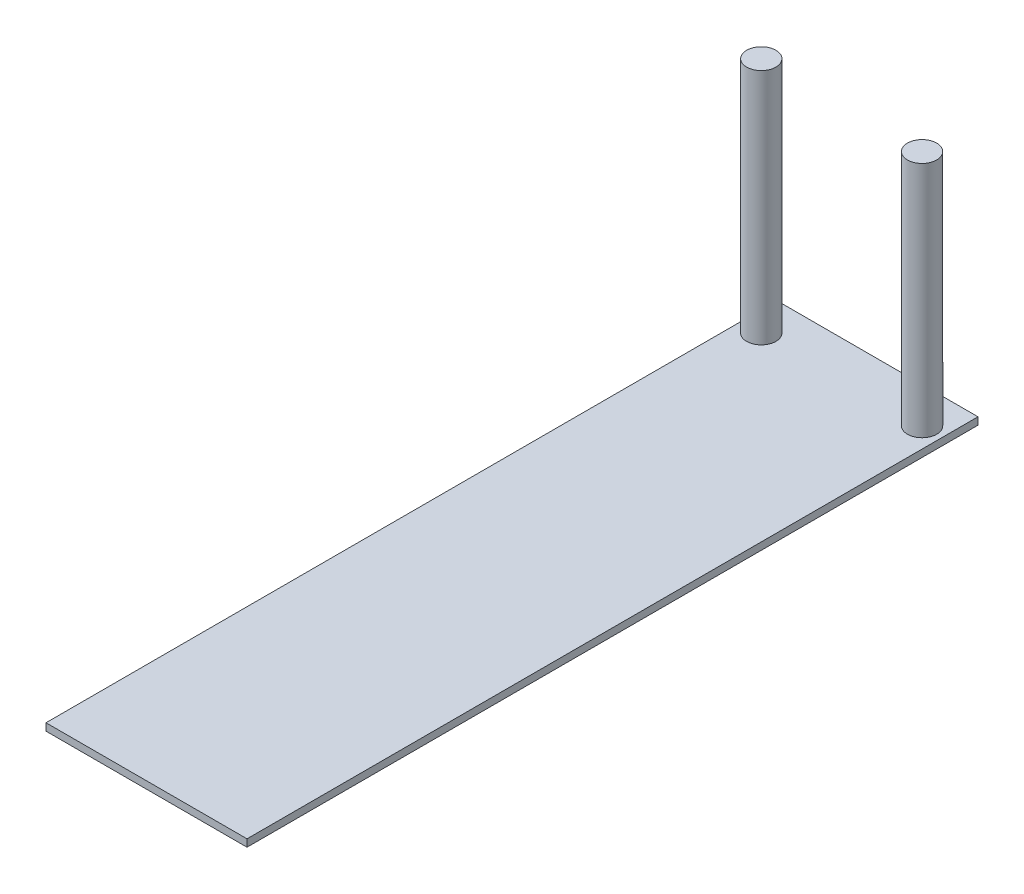
ISO-10303-21;
HEADER;
FILE_DESCRIPTION(('STEP AP214'),'2;1');
FILE_NAME('part.step','',(''),(''),'','','');
FILE_SCHEMA(('AUTOMOTIVE_DESIGN { 1 0 10303 214 1 1 1 1 }'));
ENDSEC;
DATA;
#1=APPLICATION_CONTEXT('core data for automotive mechanical design processes');
#2=APPLICATION_PROTOCOL_DEFINITION('international standard','automotive_design',2000,#1);
#3=PRODUCT_CONTEXT('',#1,'mechanical');
#4=PRODUCT('Part','Part','',(#3));
#5=PRODUCT_RELATED_PRODUCT_CATEGORY('part','',(#4));
#6=PRODUCT_DEFINITION_FORMATION('','',#4);
#7=PRODUCT_DEFINITION_CONTEXT('part definition',#1,'design');
#8=PRODUCT_DEFINITION('design','',#6,#7);
#9=PRODUCT_DEFINITION_SHAPE('','',#8);
#10=(LENGTH_UNIT() NAMED_UNIT(*) SI_UNIT(.MILLI.,.METRE.));
#11=(NAMED_UNIT(*) PLANE_ANGLE_UNIT() SI_UNIT($,.RADIAN.));
#12=(NAMED_UNIT(*) SI_UNIT($,.STERADIAN.) SOLID_ANGLE_UNIT());
#13=UNCERTAINTY_MEASURE_WITH_UNIT(LENGTH_MEASURE(1.E-05),#10,'distance_accuracy_value','');
#14=(GEOMETRIC_REPRESENTATION_CONTEXT(3) GLOBAL_UNCERTAINTY_ASSIGNED_CONTEXT((#13)) GLOBAL_UNIT_ASSIGNED_CONTEXT((#10,
#11,#12)) REPRESENTATION_CONTEXT('',''));
#15=CARTESIAN_POINT('',(0.,0.,0.));
#16=DIRECTION('',(0.,0.,1.));
#17=DIRECTION('',(1.,0.,0.));
#18=AXIS2_PLACEMENT_3D('',#15,#16,#17);
#19=CARTESIAN_POINT('',(62.865,2.54,127.));
#20=DIRECTION('',(-1.,0.,0.));
#21=DIRECTION('',(0.,0.,1.));
#22=AXIS2_PLACEMENT_3D('',#19,#20,#21);
#23=PLANE('',#22);
#24=DIRECTION('',(0.,0.,-1.));
#25=VECTOR('',#24,1.);
#26=CARTESIAN_POINT('',(62.865,0.,127.));
#27=LINE('',#26,#25);
#28=CARTESIAN_POINT('',(62.865,0.,127.));
#29=VERTEX_POINT('',#28);
#30=CARTESIAN_POINT('',(62.865,0.,-127.));
#31=VERTEX_POINT('',#30);
#32=EDGE_CURVE('E100',#29,#31,#27,.T.);
#33=ORIENTED_EDGE('',*,*,#32,.T.);
#34=DIRECTION('',(0.,-1.,0.));
#35=VECTOR('',#34,1.);
#36=CARTESIAN_POINT('',(62.865,2.54,-127.));
#37=LINE('',#36,#35);
#38=CARTESIAN_POINT('',(62.865,2.54,-127.));
#39=VERTEX_POINT('',#38);
#40=EDGE_CURVE('E91',#39,#31,#37,.T.);
#41=ORIENTED_EDGE('',*,*,#40,.F.);
#42=DIRECTION('',(0.,0.,-1.));
#43=VECTOR('',#42,1.);
#44=CARTESIAN_POINT('',(62.865,2.54,127.));
#45=LINE('',#44,#43);
#46=CARTESIAN_POINT('',(62.865,2.54,127.));
#47=VERTEX_POINT('',#46);
#48=EDGE_CURVE('E85',#47,#39,#45,.T.);
#49=ORIENTED_EDGE('',*,*,#48,.F.);
#50=DIRECTION('',(0.,-1.,0.));
#51=VECTOR('',#50,1.);
#52=CARTESIAN_POINT('',(62.865,2.54,127.));
#53=LINE('',#52,#51);
#54=EDGE_CURVE('E96',#47,#29,#53,.T.);
#55=ORIENTED_EDGE('',*,*,#54,.T.);
#56=EDGE_LOOP('',(#33,#41,#49,#55));
#57=FACE_BOUND('',#56,.T.);
#58=ADVANCED_FACE('F33',(#57),#23,.F.);
#59=CARTESIAN_POINT('',(-6.98499999999998,2.54,-127.));
#60=DIRECTION('',(0.,0.,1.));
#61=DIRECTION('',(1.,0.,0.));
#62=AXIS2_PLACEMENT_3D('',#59,#60,#61);
#63=PLANE('',#62);
#64=DIRECTION('',(-1.,0.,0.));
#65=VECTOR('',#64,1.);
#66=CARTESIAN_POINT('',(-6.98499999999998,0.,-127.));
#67=LINE('',#66,#65);
#68=CARTESIAN_POINT('',(-6.98499999999998,0.,-127.));
#69=VERTEX_POINT('',#68);
#70=EDGE_CURVE('E90',#31,#69,#67,.T.);
#71=ORIENTED_EDGE('',*,*,#70,.T.);
#72=DIRECTION('',(0.,-1.,0.));
#73=VECTOR('',#72,1.);
#74=CARTESIAN_POINT('',(-6.98499999999998,2.54,-127.));
#75=LINE('',#74,#73);
#76=CARTESIAN_POINT('',(-6.98499999999998,2.54,-127.));
#77=VERTEX_POINT('',#76);
#78=EDGE_CURVE('E88',#77,#69,#75,.T.);
#79=ORIENTED_EDGE('',*,*,#78,.F.);
#80=DIRECTION('',(-1.,0.,0.));
#81=VECTOR('',#80,1.);
#82=CARTESIAN_POINT('',(-6.98499999999998,2.54,-127.));
#83=LINE('',#82,#81);
#84=EDGE_CURVE('E80',#39,#77,#83,.T.);
#85=ORIENTED_EDGE('',*,*,#84,.F.);
#86=ORIENTED_EDGE('',*,*,#40,.T.);
#87=EDGE_LOOP('',(#71,#79,#85,#86));
#88=FACE_BOUND('',#87,.T.);
#89=ADVANCED_FACE('F89',(#88),#63,.F.);
#90=CARTESIAN_POINT('',(-6.98499999999998,2.54,127.));
#91=DIRECTION('',(1.,0.,0.));
#92=DIRECTION('',(0.,0.,-1.));
#93=AXIS2_PLACEMENT_3D('',#90,#91,#92);
#94=PLANE('',#93);
#95=DIRECTION('',(0.,0.,1.));
#96=VECTOR('',#95,1.);
#97=CARTESIAN_POINT('',(-6.98499999999998,0.,127.));
#98=LINE('',#97,#96);
#99=CARTESIAN_POINT('',(-6.98499999999998,0.,127.));
#100=VERTEX_POINT('',#99);
#101=EDGE_CURVE('E66',#69,#100,#98,.T.);
#102=ORIENTED_EDGE('',*,*,#101,.T.);
#103=DIRECTION('',(0.,-1.,0.));
#104=VECTOR('',#103,1.);
#105=CARTESIAN_POINT('',(-6.98499999999998,2.54,127.));
#106=LINE('',#105,#104);
#107=CARTESIAN_POINT('',(-6.98499999999998,2.54,127.));
#108=VERTEX_POINT('',#107);
#109=EDGE_CURVE('E92',#108,#100,#106,.T.);
#110=ORIENTED_EDGE('',*,*,#109,.F.);
#111=DIRECTION('',(0.,0.,1.));
#112=VECTOR('',#111,1.);
#113=CARTESIAN_POINT('',(-6.98499999999998,2.54,127.));
#114=LINE('',#113,#112);
#115=EDGE_CURVE('E83',#77,#108,#114,.T.);
#116=ORIENTED_EDGE('',*,*,#115,.F.);
#117=ORIENTED_EDGE('',*,*,#78,.T.);
#118=EDGE_LOOP('',(#102,#110,#116,#117));
#119=FACE_BOUND('',#118,.T.);
#120=ADVANCED_FACE('F94',(#119),#94,.F.);
#121=CARTESIAN_POINT('',(-6.98499999999998,2.54,127.));
#122=DIRECTION('',(0.,0.,-1.));
#123=DIRECTION('',(-1.,0.,0.));
#124=AXIS2_PLACEMENT_3D('',#121,#122,#123);
#125=PLANE('',#124);
#126=DIRECTION('',(1.,0.,0.));
#127=VECTOR('',#126,1.);
#128=CARTESIAN_POINT('',(-6.98499999999998,0.,127.));
#129=LINE('',#128,#127);
#130=EDGE_CURVE('E72',#100,#29,#129,.T.);
#131=ORIENTED_EDGE('',*,*,#130,.T.);
#132=ORIENTED_EDGE('',*,*,#54,.F.);
#133=DIRECTION('',(1.,0.,0.));
#134=VECTOR('',#133,1.);
#135=CARTESIAN_POINT('',(-6.98499999999998,2.54,127.));
#136=LINE('',#135,#134);
#137=EDGE_CURVE('E49',#108,#47,#136,.T.);
#138=ORIENTED_EDGE('',*,*,#137,.F.);
#139=ORIENTED_EDGE('',*,*,#109,.T.);
#140=EDGE_LOOP('',(#131,#132,#138,#139));
#141=FACE_BOUND('',#140,.T.);
#142=ADVANCED_FACE('F116',(#141),#125,.F.);
#143=CARTESIAN_POINT('',(0.,2.54,0.));
#144=DIRECTION('',(0.,-1.,0.));
#145=DIRECTION('',(0.,0.,-1.));
#146=AXIS2_PLACEMENT_3D('',#143,#144,#145);
#147=PLANE('',#146);
#148=CARTESIAN_POINT('',(55.88,2.54,-114.561094582382));
#149=DIRECTION('',(0.,-1.,0.));
#150=DIRECTION('',(0.,0.,-1.));
#151=AXIS2_PLACEMENT_3D('',#148,#149,#150);
#152=CIRCLE('',#151,5.08000000000001);
#153=CARTESIAN_POINT('',(55.88,2.54,-119.641094582382));
#154=VERTEX_POINT('',#153);
#155=EDGE_CURVE('E11',#154,#154,#152,.F.);
#156=ORIENTED_EDGE('',*,*,#155,.F.);
#157=EDGE_LOOP('',(#156));
#158=FACE_BOUND('',#157,.T.);
#159=CARTESIAN_POINT('',(0.,2.54,-114.561094582382));
#160=DIRECTION('',(0.,-1.,0.));
#161=DIRECTION('',(0.,0.,-1.));
#162=AXIS2_PLACEMENT_3D('',#159,#160,#161);
#163=CIRCLE('',#162,5.08);
#164=CARTESIAN_POINT('',(0.,2.54,-119.641094582382));
#165=VERTEX_POINT('',#164);
#166=EDGE_CURVE('E41',#165,#165,#163,.F.);
#167=ORIENTED_EDGE('',*,*,#166,.F.);
#168=EDGE_LOOP('',(#167));
#169=FACE_BOUND('',#168,.T.);
#170=ORIENTED_EDGE('',*,*,#48,.T.);
#171=ORIENTED_EDGE('',*,*,#84,.T.);
#172=ORIENTED_EDGE('',*,*,#115,.T.);
#173=ORIENTED_EDGE('',*,*,#137,.T.);
#174=EDGE_LOOP('',(#170,#171,#172,#173));
#175=FACE_BOUND('',#174,.T.);
#176=ADVANCED_FACE('F81',(#158,#169,#175),#147,.F.);
#177=CARTESIAN_POINT('',(0.,0.,0.));
#178=DIRECTION('',(0.,-1.,0.));
#179=DIRECTION('',(0.,0.,-1.));
#180=AXIS2_PLACEMENT_3D('',#177,#178,#179);
#181=PLANE('',#180);
#182=ORIENTED_EDGE('',*,*,#32,.F.);
#183=ORIENTED_EDGE('',*,*,#130,.F.);
#184=ORIENTED_EDGE('',*,*,#101,.F.);
#185=ORIENTED_EDGE('',*,*,#70,.F.);
#186=EDGE_LOOP('',(#182,#183,#184,#185));
#187=FACE_BOUND('',#186,.T.);
#188=ADVANCED_FACE('F115',(#187),#181,.T.);
#189=CARTESIAN_POINT('',(0.,85.09,-114.561094582382));
#190=DIRECTION('',(0.,-1.,0.));
#191=DIRECTION('',(0.,0.,-1.));
#192=AXIS2_PLACEMENT_3D('',#189,#190,#191);
#193=CYLINDRICAL_SURFACE('',#192,5.08);
#194=CARTESIAN_POINT('',(0.,85.09,-114.561094582382));
#195=DIRECTION('',(0.,1.,0.));
#196=DIRECTION('',(0.,0.,1.));
#197=AXIS2_PLACEMENT_3D('',#194,#195,#196);
#198=CIRCLE('',#197,5.08);
#199=CARTESIAN_POINT('',(0.,85.09,-109.481094582382));
#200=VERTEX_POINT('',#199);
#201=EDGE_CURVE('E103',#200,#200,#198,.T.);
#202=ORIENTED_EDGE('',*,*,#201,.F.);
#203=EDGE_LOOP('',(#202));
#204=FACE_BOUND('',#203,.T.);
#205=ORIENTED_EDGE('',*,*,#166,.T.);
#206=EDGE_LOOP('',(#205));
#207=FACE_BOUND('',#206,.T.);
#208=ADVANCED_FACE('F112',(#204,#207),#193,.T.);
#209=CARTESIAN_POINT('',(0.,85.09,-114.561094582382));
#210=DIRECTION('',(0.,1.,0.));
#211=DIRECTION('',(0.,0.,1.));
#212=AXIS2_PLACEMENT_3D('',#209,#210,#211);
#213=PLANE('',#212);
#214=ORIENTED_EDGE('',*,*,#201,.T.);
#215=EDGE_LOOP('',(#214));
#216=FACE_BOUND('',#215,.T.);
#217=ADVANCED_FACE('F146',(#216),#213,.T.);
#218=CARTESIAN_POINT('',(55.88,85.09,-114.561094582382));
#219=DIRECTION('',(0.,-1.,0.));
#220=DIRECTION('',(0.,0.,-1.));
#221=AXIS2_PLACEMENT_3D('',#218,#219,#220);
#222=CYLINDRICAL_SURFACE('',#221,5.08000000000001);
#223=CARTESIAN_POINT('',(55.88,85.09,-114.561094582382));
#224=DIRECTION('',(0.,1.,0.));
#225=DIRECTION('',(0.,0.,1.));
#226=AXIS2_PLACEMENT_3D('',#223,#224,#225);
#227=CIRCLE('',#226,5.08000000000001);
#228=CARTESIAN_POINT('',(55.88,85.09,-109.481094582382));
#229=VERTEX_POINT('',#228);
#230=EDGE_CURVE('E137',#229,#229,#227,.T.);
#231=ORIENTED_EDGE('',*,*,#230,.F.);
#232=EDGE_LOOP('',(#231));
#233=FACE_BOUND('',#232,.T.);
#234=ORIENTED_EDGE('',*,*,#155,.T.);
#235=EDGE_LOOP('',(#234));
#236=FACE_BOUND('',#235,.T.);
#237=ADVANCED_FACE('F143',(#233,#236),#222,.T.);
#238=CARTESIAN_POINT('',(55.88,85.09,-114.561094582382));
#239=DIRECTION('',(0.,1.,0.));
#240=DIRECTION('',(0.,0.,1.));
#241=AXIS2_PLACEMENT_3D('',#238,#239,#240);
#242=PLANE('',#241);
#243=ORIENTED_EDGE('',*,*,#230,.T.);
#244=EDGE_LOOP('',(#243));
#245=FACE_BOUND('',#244,.T.);
#246=ADVANCED_FACE('F141',(#245),#242,.T.);
#247=CLOSED_SHELL('',(#58,#89,#120,#142,#176,#188,#208,#217,#237,#246));
#248=MANIFOLD_SOLID_BREP('B2',#247);
#249=ADVANCED_BREP_SHAPE_REPRESENTATION('',(#18,#248),#14);
#250=SHAPE_DEFINITION_REPRESENTATION(#9,#249);
ENDSEC;
END-ISO-10303-21;
